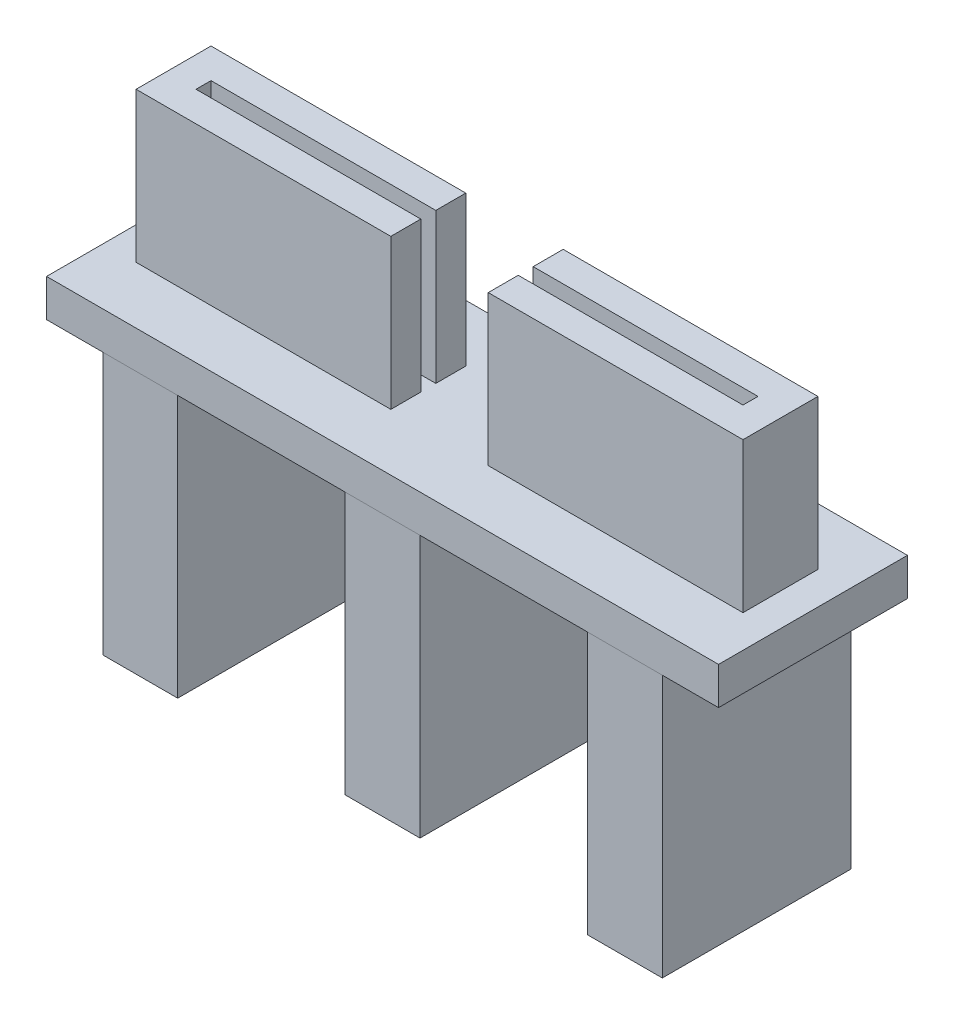
ISO-10303-21;
HEADER;
FILE_DESCRIPTION(('STEP AP214'),'2;1');
FILE_NAME('part.step','',(''),(''),'','','');
FILE_SCHEMA(('AUTOMOTIVE_DESIGN { 1 0 10303 214 1 1 1 1 }'));
ENDSEC;
DATA;
#1=APPLICATION_CONTEXT('core data for automotive mechanical design processes');
#2=APPLICATION_PROTOCOL_DEFINITION('international standard','automotive_design',2000,#1);
#3=PRODUCT_CONTEXT('',#1,'mechanical');
#4=PRODUCT('Part','Part','',(#3));
#5=PRODUCT_RELATED_PRODUCT_CATEGORY('part','',(#4));
#6=PRODUCT_DEFINITION_FORMATION('','',#4);
#7=PRODUCT_DEFINITION_CONTEXT('part definition',#1,'design');
#8=PRODUCT_DEFINITION('design','',#6,#7);
#9=PRODUCT_DEFINITION_SHAPE('','',#8);
#10=(LENGTH_UNIT() NAMED_UNIT(*) SI_UNIT(.MILLI.,.METRE.));
#11=(NAMED_UNIT(*) PLANE_ANGLE_UNIT() SI_UNIT($,.RADIAN.));
#12=(NAMED_UNIT(*) SI_UNIT($,.STERADIAN.) SOLID_ANGLE_UNIT());
#13=UNCERTAINTY_MEASURE_WITH_UNIT(LENGTH_MEASURE(1.E-05),#10,'distance_accuracy_value','');
#14=(GEOMETRIC_REPRESENTATION_CONTEXT(3) GLOBAL_UNCERTAINTY_ASSIGNED_CONTEXT((#13)) GLOBAL_UNIT_ASSIGNED_CONTEXT((#10,
#11,#12)) REPRESENTATION_CONTEXT('',''));
#15=CARTESIAN_POINT('',(0.,0.,0.));
#16=DIRECTION('',(0.,0.,1.));
#17=DIRECTION('',(1.,0.,0.));
#18=AXIS2_PLACEMENT_3D('',#15,#16,#17);
#19=CARTESIAN_POINT('',(0.,35.,0.));
#20=DIRECTION('',(0.,-1.,0.));
#21=DIRECTION('',(0.,0.,-1.));
#22=AXIS2_PLACEMENT_3D('',#19,#20,#21);
#23=PLANE('',#22);
#24=DIRECTION('',(-1.,0.,0.));
#25=VECTOR('',#24,1.);
#26=CARTESIAN_POINT('',(0.,35.,12.6054154397863));
#27=LINE('',#26,#25);
#28=CARTESIAN_POINT('',(5.00000000000002,35.,12.6054154397863));
#29=VERTEX_POINT('',#28);
#30=CARTESIAN_POINT('',(-4.99999999999998,35.,12.6054154397863));
#31=VERTEX_POINT('',#30);
#32=EDGE_CURVE('E131',#29,#31,#27,.T.);
#33=ORIENTED_EDGE('',*,*,#32,.F.);
#34=DIRECTION('',(0.,0.,1.));
#35=VECTOR('',#34,1.);
#36=CARTESIAN_POINT('',(5.00000000000002,35.,0.));
#37=LINE('',#36,#35);
#38=CARTESIAN_POINT('',(5.00000000000003,35.,-12.6054154397863));
#39=VERTEX_POINT('',#38);
#40=EDGE_CURVE('E126',#39,#29,#37,.T.);
#41=ORIENTED_EDGE('',*,*,#40,.F.);
#42=DIRECTION('',(1.,0.,0.));
#43=VECTOR('',#42,1.);
#44=CARTESIAN_POINT('',(0.,35.,-12.6054154397863));
#45=LINE('',#44,#43);
#46=CARTESIAN_POINT('',(-4.99999999999997,35.,-12.6054154397863));
#47=VERTEX_POINT('',#46);
#48=EDGE_CURVE('E121',#47,#39,#45,.T.);
#49=ORIENTED_EDGE('',*,*,#48,.F.);
#50=DIRECTION('',(0.,0.,-1.));
#51=VECTOR('',#50,1.);
#52=CARTESIAN_POINT('',(-4.99999999999998,35.,0.));
#53=LINE('',#52,#51);
#54=EDGE_CURVE('E120',#31,#47,#53,.T.);
#55=ORIENTED_EDGE('',*,*,#54,.F.);
#56=EDGE_LOOP('',(#33,#41,#49,#55));
#57=FACE_BOUND('',#56,.T.);
#58=ADVANCED_FACE('F69',(#57),#23,.F.);
#59=CARTESIAN_POINT('',(-4.99999999999998,40.002,0.));
#60=DIRECTION('',(1.,0.,0.));
#61=DIRECTION('',(0.,0.,-1.));
#62=AXIS2_PLACEMENT_3D('',#59,#60,#61);
#63=PLANE('',#62);
#64=DIRECTION('',(0.,-1.,0.));
#65=VECTOR('',#64,1.);
#66=CARTESIAN_POINT('',(-4.99999999999998,40.002,12.6054154397863));
#67=LINE('',#66,#65);
#68=CARTESIAN_POINT('',(-4.99999999999998,0.,12.6054154397863));
#69=VERTEX_POINT('',#68);
#70=EDGE_CURVE('E84',#31,#69,#67,.T.);
#71=ORIENTED_EDGE('',*,*,#70,.F.);
#72=ORIENTED_EDGE('',*,*,#54,.T.);
#73=DIRECTION('',(0.,1.,0.));
#74=VECTOR('',#73,1.);
#75=CARTESIAN_POINT('',(-4.99999999999997,40.002,-12.6054154397863));
#76=LINE('',#75,#74);
#77=CARTESIAN_POINT('',(-4.99999999999998,0.,-12.6054154397863));
#78=VERTEX_POINT('',#77);
#79=EDGE_CURVE('E108',#78,#47,#76,.T.);
#80=ORIENTED_EDGE('',*,*,#79,.F.);
#81=DIRECTION('',(0.,0.,1.));
#82=VECTOR('',#81,1.);
#83=CARTESIAN_POINT('',(-4.99999999999998,0.,0.));
#84=LINE('',#83,#82);
#85=EDGE_CURVE('E118',#78,#69,#84,.T.);
#86=ORIENTED_EDGE('',*,*,#85,.T.);
#87=EDGE_LOOP('',(#71,#72,#80,#86));
#88=FACE_BOUND('',#87,.T.);
#89=ADVANCED_FACE('F71',(#88),#63,.F.);
#90=CARTESIAN_POINT('',(5.00000000000002,40.002,0.));
#91=DIRECTION('',(-1.,0.,0.));
#92=DIRECTION('',(0.,0.,1.));
#93=AXIS2_PLACEMENT_3D('',#90,#91,#92);
#94=PLANE('',#93);
#95=DIRECTION('',(0.,1.,0.));
#96=VECTOR('',#95,1.);
#97=CARTESIAN_POINT('',(5.00000000000002,40.002,12.6054154397863));
#98=LINE('',#97,#96);
#99=CARTESIAN_POINT('',(5.00000000000002,0.,12.6054154397863));
#100=VERTEX_POINT('',#99);
#101=EDGE_CURVE('E134',#100,#29,#98,.T.);
#102=ORIENTED_EDGE('',*,*,#101,.F.);
#103=DIRECTION('',(0.,0.,-1.));
#104=VECTOR('',#103,1.);
#105=CARTESIAN_POINT('',(5.00000000000002,0.,0.));
#106=LINE('',#105,#104);
#107=CARTESIAN_POINT('',(5.00000000000003,0.,-12.6054154397863));
#108=VERTEX_POINT('',#107);
#109=EDGE_CURVE('E114',#100,#108,#106,.T.);
#110=ORIENTED_EDGE('',*,*,#109,.T.);
#111=DIRECTION('',(0.,-1.,0.));
#112=VECTOR('',#111,1.);
#113=CARTESIAN_POINT('',(5.00000000000003,40.002,-12.6054154397863));
#114=LINE('',#113,#112);
#115=EDGE_CURVE('E91',#39,#108,#114,.T.);
#116=ORIENTED_EDGE('',*,*,#115,.F.);
#117=ORIENTED_EDGE('',*,*,#40,.T.);
#118=EDGE_LOOP('',(#102,#110,#116,#117));
#119=FACE_BOUND('',#118,.T.);
#120=ADVANCED_FACE('F141',(#119),#94,.F.);
#121=CARTESIAN_POINT('',(0.,0.,0.));
#122=DIRECTION('',(0.,-1.,0.));
#123=DIRECTION('',(0.,0.,-1.));
#124=AXIS2_PLACEMENT_3D('',#121,#122,#123);
#125=PLANE('',#124);
#126=ORIENTED_EDGE('',*,*,#109,.F.);
#127=DIRECTION('',(-1.,0.,0.));
#128=VECTOR('',#127,1.);
#129=CARTESIAN_POINT('',(0.,0.,12.6054154397863));
#130=LINE('',#129,#128);
#131=EDGE_CURVE('E14',#100,#69,#130,.T.);
#132=ORIENTED_EDGE('',*,*,#131,.T.);
#133=ORIENTED_EDGE('',*,*,#85,.F.);
#134=DIRECTION('',(1.,0.,0.));
#135=VECTOR('',#134,1.);
#136=CARTESIAN_POINT('',(0.,0.,-12.6054154397863));
#137=LINE('',#136,#135);
#138=EDGE_CURVE('E77',#78,#108,#137,.T.);
#139=ORIENTED_EDGE('',*,*,#138,.T.);
#140=EDGE_LOOP('',(#126,#132,#133,#139));
#141=FACE_BOUND('',#140,.T.);
#142=ADVANCED_FACE('F123',(#141),#125,.T.);
#143=CARTESIAN_POINT('',(-44.8422155808786,-30.,-12.6054154397863));
#144=DIRECTION('',(0.,0.,-1.));
#145=DIRECTION('',(-1.,0.,0.));
#146=AXIS2_PLACEMENT_3D('',#143,#144,#145);
#147=PLANE('',#146);
#148=ORIENTED_EDGE('',*,*,#48,.T.);
#149=ORIENTED_EDGE('',*,*,#115,.T.);
#150=ORIENTED_EDGE('',*,*,#138,.F.);
#151=ORIENTED_EDGE('',*,*,#79,.T.);
#152=EDGE_LOOP('',(#148,#149,#150,#151));
#153=FACE_BOUND('',#152,.T.);
#154=ADVANCED_FACE('F107',(#153),#147,.T.);
#155=CARTESIAN_POINT('',(-44.8422155808786,-30.,12.6054154397863));
#156=DIRECTION('',(0.,0.,1.));
#157=DIRECTION('',(1.,0.,0.));
#158=AXIS2_PLACEMENT_3D('',#155,#156,#157);
#159=PLANE('',#158);
#160=ORIENTED_EDGE('',*,*,#32,.T.);
#161=ORIENTED_EDGE('',*,*,#70,.T.);
#162=ORIENTED_EDGE('',*,*,#131,.F.);
#163=ORIENTED_EDGE('',*,*,#101,.T.);
#164=EDGE_LOOP('',(#160,#161,#162,#163));
#165=FACE_BOUND('',#164,.T.);
#166=ADVANCED_FACE('F143',(#165),#159,.T.);
#167=CLOSED_SHELL('',(#58,#89,#120,#142,#154,#166));
#168=MANIFOLD_SOLID_BREP('B2',#167);
#169=CARTESIAN_POINT('',(0.,35.,0.));
#170=DIRECTION('',(0.,-1.,0.));
#171=DIRECTION('',(0.,0.,-1.));
#172=AXIS2_PLACEMENT_3D('',#169,#170,#171);
#173=PLANE('',#172);
#174=DIRECTION('',(-1.,0.,0.));
#175=VECTOR('',#174,1.);
#176=CARTESIAN_POINT('',(0.,35.,12.6054154397863));
#177=LINE('',#176,#175);
#178=CARTESIAN_POINT('',(37.3395555688102,35.,12.6054154397863));
#179=VERTEX_POINT('',#178);
#180=CARTESIAN_POINT('',(27.3395555688102,35.,12.6054154397863));
#181=VERTEX_POINT('',#180);
#182=EDGE_CURVE('E264',#179,#181,#177,.T.);
#183=ORIENTED_EDGE('',*,*,#182,.F.);
#184=DIRECTION('',(0.,0.,1.));
#185=VECTOR('',#184,1.);
#186=CARTESIAN_POINT('',(37.3395555688102,35.,0.));
#187=LINE('',#186,#185);
#188=CARTESIAN_POINT('',(37.3395555688102,35.,-12.6054154397863));
#189=VERTEX_POINT('',#188);
#190=EDGE_CURVE('E259',#189,#179,#187,.T.);
#191=ORIENTED_EDGE('',*,*,#190,.F.);
#192=DIRECTION('',(1.,0.,0.));
#193=VECTOR('',#192,1.);
#194=CARTESIAN_POINT('',(0.,35.,-12.6054154397863));
#195=LINE('',#194,#193);
#196=CARTESIAN_POINT('',(27.3395555688102,35.,-12.6054154397863));
#197=VERTEX_POINT('',#196);
#198=EDGE_CURVE('E254',#197,#189,#195,.T.);
#199=ORIENTED_EDGE('',*,*,#198,.F.);
#200=DIRECTION('',(0.,0.,-1.));
#201=VECTOR('',#200,1.);
#202=CARTESIAN_POINT('',(27.3395555688102,35.,0.));
#203=LINE('',#202,#201);
#204=EDGE_CURVE('E253',#181,#197,#203,.T.);
#205=ORIENTED_EDGE('',*,*,#204,.F.);
#206=EDGE_LOOP('',(#183,#191,#199,#205));
#207=FACE_BOUND('',#206,.T.);
#208=ADVANCED_FACE('F202',(#207),#173,.F.);
#209=CARTESIAN_POINT('',(27.3395555688102,40.002,0.));
#210=DIRECTION('',(1.,0.,0.));
#211=DIRECTION('',(0.,0.,-1.));
#212=AXIS2_PLACEMENT_3D('',#209,#210,#211);
#213=PLANE('',#212);
#214=DIRECTION('',(0.,-1.,0.));
#215=VECTOR('',#214,1.);
#216=CARTESIAN_POINT('',(27.3395555688102,40.002,12.6054154397863));
#217=LINE('',#216,#215);
#218=CARTESIAN_POINT('',(27.3395555688102,0.,12.6054154397863));
#219=VERTEX_POINT('',#218);
#220=EDGE_CURVE('E217',#181,#219,#217,.T.);
#221=ORIENTED_EDGE('',*,*,#220,.F.);
#222=ORIENTED_EDGE('',*,*,#204,.T.);
#223=DIRECTION('',(0.,1.,0.));
#224=VECTOR('',#223,1.);
#225=CARTESIAN_POINT('',(27.3395555688102,40.002,-12.6054154397863));
#226=LINE('',#225,#224);
#227=CARTESIAN_POINT('',(27.3395555688102,0.,-12.6054154397863));
#228=VERTEX_POINT('',#227);
#229=EDGE_CURVE('E241',#228,#197,#226,.T.);
#230=ORIENTED_EDGE('',*,*,#229,.F.);
#231=DIRECTION('',(0.,0.,1.));
#232=VECTOR('',#231,1.);
#233=CARTESIAN_POINT('',(27.3395555688102,0.,0.));
#234=LINE('',#233,#232);
#235=EDGE_CURVE('E251',#228,#219,#234,.T.);
#236=ORIENTED_EDGE('',*,*,#235,.T.);
#237=EDGE_LOOP('',(#221,#222,#230,#236));
#238=FACE_BOUND('',#237,.T.);
#239=ADVANCED_FACE('F204',(#238),#213,.F.);
#240=CARTESIAN_POINT('',(37.3395555688102,40.002,0.));
#241=DIRECTION('',(-1.,0.,0.));
#242=DIRECTION('',(0.,0.,1.));
#243=AXIS2_PLACEMENT_3D('',#240,#241,#242);
#244=PLANE('',#243);
#245=DIRECTION('',(0.,1.,0.));
#246=VECTOR('',#245,1.);
#247=CARTESIAN_POINT('',(37.3395555688102,40.002,12.6054154397863));
#248=LINE('',#247,#246);
#249=CARTESIAN_POINT('',(37.3395555688102,0.,12.6054154397863));
#250=VERTEX_POINT('',#249);
#251=EDGE_CURVE('E267',#250,#179,#248,.T.);
#252=ORIENTED_EDGE('',*,*,#251,.F.);
#253=DIRECTION('',(0.,0.,-1.));
#254=VECTOR('',#253,1.);
#255=CARTESIAN_POINT('',(37.3395555688102,0.,0.));
#256=LINE('',#255,#254);
#257=CARTESIAN_POINT('',(37.3395555688102,0.,-12.6054154397863));
#258=VERTEX_POINT('',#257);
#259=EDGE_CURVE('E247',#250,#258,#256,.T.);
#260=ORIENTED_EDGE('',*,*,#259,.T.);
#261=DIRECTION('',(0.,-1.,0.));
#262=VECTOR('',#261,1.);
#263=CARTESIAN_POINT('',(37.3395555688102,40.002,-12.6054154397863));
#264=LINE('',#263,#262);
#265=EDGE_CURVE('E224',#189,#258,#264,.T.);
#266=ORIENTED_EDGE('',*,*,#265,.F.);
#267=ORIENTED_EDGE('',*,*,#190,.T.);
#268=EDGE_LOOP('',(#252,#260,#266,#267));
#269=FACE_BOUND('',#268,.T.);
#270=ADVANCED_FACE('F274',(#269),#244,.F.);
#271=CARTESIAN_POINT('',(0.,0.,0.));
#272=DIRECTION('',(0.,-1.,0.));
#273=DIRECTION('',(0.,0.,-1.));
#274=AXIS2_PLACEMENT_3D('',#271,#272,#273);
#275=PLANE('',#274);
#276=ORIENTED_EDGE('',*,*,#259,.F.);
#277=DIRECTION('',(-1.,0.,0.));
#278=VECTOR('',#277,1.);
#279=CARTESIAN_POINT('',(0.,0.,12.6054154397863));
#280=LINE('',#279,#278);
#281=EDGE_CURVE('E67',#250,#219,#280,.T.);
#282=ORIENTED_EDGE('',*,*,#281,.T.);
#283=ORIENTED_EDGE('',*,*,#235,.F.);
#284=DIRECTION('',(1.,0.,0.));
#285=VECTOR('',#284,1.);
#286=CARTESIAN_POINT('',(0.,0.,-12.6054154397863));
#287=LINE('',#286,#285);
#288=EDGE_CURVE('E210',#228,#258,#287,.T.);
#289=ORIENTED_EDGE('',*,*,#288,.T.);
#290=EDGE_LOOP('',(#276,#282,#283,#289));
#291=FACE_BOUND('',#290,.T.);
#292=ADVANCED_FACE('F256',(#291),#275,.T.);
#293=CARTESIAN_POINT('',(-44.8422155808786,-30.,-12.6054154397863));
#294=DIRECTION('',(0.,0.,-1.));
#295=DIRECTION('',(-1.,0.,0.));
#296=AXIS2_PLACEMENT_3D('',#293,#294,#295);
#297=PLANE('',#296);
#298=ORIENTED_EDGE('',*,*,#198,.T.);
#299=ORIENTED_EDGE('',*,*,#265,.T.);
#300=ORIENTED_EDGE('',*,*,#288,.F.);
#301=ORIENTED_EDGE('',*,*,#229,.T.);
#302=EDGE_LOOP('',(#298,#299,#300,#301));
#303=FACE_BOUND('',#302,.T.);
#304=ADVANCED_FACE('F240',(#303),#297,.T.);
#305=CARTESIAN_POINT('',(-44.8422155808786,-30.,12.6054154397863));
#306=DIRECTION('',(0.,0.,1.));
#307=DIRECTION('',(1.,0.,0.));
#308=AXIS2_PLACEMENT_3D('',#305,#306,#307);
#309=PLANE('',#308);
#310=ORIENTED_EDGE('',*,*,#182,.T.);
#311=ORIENTED_EDGE('',*,*,#220,.T.);
#312=ORIENTED_EDGE('',*,*,#281,.F.);
#313=ORIENTED_EDGE('',*,*,#251,.T.);
#314=EDGE_LOOP('',(#310,#311,#312,#313));
#315=FACE_BOUND('',#314,.T.);
#316=ADVANCED_FACE('F276',(#315),#309,.T.);
#317=CLOSED_SHELL('',(#208,#239,#270,#292,#304,#316));
#318=MANIFOLD_SOLID_BREP('B8',#317);
#319=CARTESIAN_POINT('',(0.,35.,0.));
#320=DIRECTION('',(0.,-1.,0.));
#321=DIRECTION('',(0.,0.,-1.));
#322=AXIS2_PLACEMENT_3D('',#319,#320,#321);
#323=PLANE('',#322);
#324=DIRECTION('',(-1.,0.,0.));
#325=VECTOR('',#324,1.);
#326=CARTESIAN_POINT('',(0.,35.,12.6054154397863));
#327=LINE('',#326,#325);
#328=CARTESIAN_POINT('',(-27.3395555688102,35.,12.6054154397863));
#329=VERTEX_POINT('',#328);
#330=CARTESIAN_POINT('',(-37.3395555688102,35.,12.6054154397863));
#331=VERTEX_POINT('',#330);
#332=EDGE_CURVE('E393',#329,#331,#327,.T.);
#333=ORIENTED_EDGE('',*,*,#332,.F.);
#334=DIRECTION('',(0.,0.,-1.));
#335=VECTOR('',#334,1.);
#336=CARTESIAN_POINT('',(-27.3395555688102,35.,0.));
#337=LINE('',#336,#335);
#338=CARTESIAN_POINT('',(-27.3395555688102,35.,-12.6054154397863));
#339=VERTEX_POINT('',#338);
#340=EDGE_CURVE('E388',#329,#339,#337,.T.);
#341=ORIENTED_EDGE('',*,*,#340,.T.);
#342=DIRECTION('',(1.,0.,0.));
#343=VECTOR('',#342,1.);
#344=CARTESIAN_POINT('',(0.,35.,-12.6054154397863));
#345=LINE('',#344,#343);
#346=CARTESIAN_POINT('',(-37.3395555688102,35.,-12.6054154397863));
#347=VERTEX_POINT('',#346);
#348=EDGE_CURVE('E385',#347,#339,#345,.T.);
#349=ORIENTED_EDGE('',*,*,#348,.F.);
#350=DIRECTION('',(0.,0.,1.));
#351=VECTOR('',#350,1.);
#352=CARTESIAN_POINT('',(-37.3395555688102,35.,0.));
#353=LINE('',#352,#351);
#354=EDGE_CURVE('E378',#347,#331,#353,.T.);
#355=ORIENTED_EDGE('',*,*,#354,.T.);
#356=EDGE_LOOP('',(#333,#341,#349,#355));
#357=FACE_BOUND('',#356,.T.);
#358=ADVANCED_FACE('F334',(#357),#323,.F.);
#359=CARTESIAN_POINT('',(-37.3395555688102,40.002,0.));
#360=DIRECTION('',(-1.,0.,0.));
#361=DIRECTION('',(0.,0.,1.));
#362=AXIS2_PLACEMENT_3D('',#359,#360,#361);
#363=PLANE('',#362);
#364=DIRECTION('',(0.,0.,-1.));
#365=VECTOR('',#364,1.);
#366=CARTESIAN_POINT('',(-37.3395555688102,0.,0.));
#367=LINE('',#366,#365);
#368=CARTESIAN_POINT('',(-37.3395555688102,0.,12.6054154397863));
#369=VERTEX_POINT('',#368);
#370=CARTESIAN_POINT('',(-37.3395555688102,0.,-12.6054154397863));
#371=VERTEX_POINT('',#370);
#372=EDGE_CURVE('E383',#369,#371,#367,.T.);
#373=ORIENTED_EDGE('',*,*,#372,.F.);
#374=DIRECTION('',(0.,1.,0.));
#375=VECTOR('',#374,1.);
#376=CARTESIAN_POINT('',(-37.3395555688102,40.002,12.6054154397863));
#377=LINE('',#376,#375);
#378=EDGE_CURVE('E348',#369,#331,#377,.T.);
#379=ORIENTED_EDGE('',*,*,#378,.T.);
#380=ORIENTED_EDGE('',*,*,#354,.F.);
#381=DIRECTION('',(0.,-1.,0.));
#382=VECTOR('',#381,1.);
#383=CARTESIAN_POINT('',(-37.3395555688102,40.002,-12.6054154397863));
#384=LINE('',#383,#382);
#385=EDGE_CURVE('E372',#347,#371,#384,.T.);
#386=ORIENTED_EDGE('',*,*,#385,.T.);
#387=EDGE_LOOP('',(#373,#379,#380,#386));
#388=FACE_BOUND('',#387,.T.);
#389=ADVANCED_FACE('F382',(#388),#363,.T.);
#390=CARTESIAN_POINT('',(-27.3395555688102,40.002,0.));
#391=DIRECTION('',(1.,0.,0.));
#392=DIRECTION('',(0.,0.,-1.));
#393=AXIS2_PLACEMENT_3D('',#390,#391,#392);
#394=PLANE('',#393);
#395=ORIENTED_EDGE('',*,*,#340,.F.);
#396=DIRECTION('',(0.,-1.,0.));
#397=VECTOR('',#396,1.);
#398=CARTESIAN_POINT('',(-27.3395555688102,40.002,12.6054154397863));
#399=LINE('',#398,#397);
#400=CARTESIAN_POINT('',(-27.3395555688102,0.,12.6054154397863));
#401=VERTEX_POINT('',#400);
#402=EDGE_CURVE('E400',#329,#401,#399,.T.);
#403=ORIENTED_EDGE('',*,*,#402,.T.);
#404=DIRECTION('',(0.,0.,1.));
#405=VECTOR('',#404,1.);
#406=CARTESIAN_POINT('',(-27.3395555688102,0.,0.));
#407=LINE('',#406,#405);
#408=CARTESIAN_POINT('',(-27.3395555688102,0.,-12.6054154397863));
#409=VERTEX_POINT('',#408);
#410=EDGE_CURVE('E389',#409,#401,#407,.T.);
#411=ORIENTED_EDGE('',*,*,#410,.F.);
#412=DIRECTION('',(0.,1.,0.));
#413=VECTOR('',#412,1.);
#414=CARTESIAN_POINT('',(-27.3395555688102,40.002,-12.6054154397863));
#415=LINE('',#414,#413);
#416=EDGE_CURVE('E355',#409,#339,#415,.T.);
#417=ORIENTED_EDGE('',*,*,#416,.T.);
#418=EDGE_LOOP('',(#395,#403,#411,#417));
#419=FACE_BOUND('',#418,.T.);
#420=ADVANCED_FACE('F408',(#419),#394,.T.);
#421=CARTESIAN_POINT('',(0.,0.,0.));
#422=DIRECTION('',(0.,-1.,0.));
#423=DIRECTION('',(0.,0.,-1.));
#424=AXIS2_PLACEMENT_3D('',#421,#422,#423);
#425=PLANE('',#424);
#426=ORIENTED_EDGE('',*,*,#410,.T.);
#427=DIRECTION('',(-1.,0.,0.));
#428=VECTOR('',#427,1.);
#429=CARTESIAN_POINT('',(0.,0.,12.6054154397863));
#430=LINE('',#429,#428);
#431=EDGE_CURVE('E200',#401,#369,#430,.T.);
#432=ORIENTED_EDGE('',*,*,#431,.T.);
#433=ORIENTED_EDGE('',*,*,#372,.T.);
#434=DIRECTION('',(1.,0.,0.));
#435=VECTOR('',#434,1.);
#436=CARTESIAN_POINT('',(0.,0.,-12.6054154397863));
#437=LINE('',#436,#435);
#438=EDGE_CURVE('E341',#371,#409,#437,.T.);
#439=ORIENTED_EDGE('',*,*,#438,.T.);
#440=EDGE_LOOP('',(#426,#432,#433,#439));
#441=FACE_BOUND('',#440,.T.);
#442=ADVANCED_FACE('F387',(#441),#425,.T.);
#443=CARTESIAN_POINT('',(-44.8422155808786,-30.,-12.6054154397863));
#444=DIRECTION('',(0.,0.,-1.));
#445=DIRECTION('',(-1.,0.,0.));
#446=AXIS2_PLACEMENT_3D('',#443,#444,#445);
#447=PLANE('',#446);
#448=ORIENTED_EDGE('',*,*,#348,.T.);
#449=ORIENTED_EDGE('',*,*,#416,.F.);
#450=ORIENTED_EDGE('',*,*,#438,.F.);
#451=ORIENTED_EDGE('',*,*,#385,.F.);
#452=EDGE_LOOP('',(#448,#449,#450,#451));
#453=FACE_BOUND('',#452,.T.);
#454=ADVANCED_FACE('F371',(#453),#447,.T.);
#455=CARTESIAN_POINT('',(-44.8422155808786,-30.,12.6054154397863));
#456=DIRECTION('',(0.,0.,1.));
#457=DIRECTION('',(1.,0.,0.));
#458=AXIS2_PLACEMENT_3D('',#455,#456,#457);
#459=PLANE('',#458);
#460=ORIENTED_EDGE('',*,*,#332,.T.);
#461=ORIENTED_EDGE('',*,*,#378,.F.);
#462=ORIENTED_EDGE('',*,*,#431,.F.);
#463=ORIENTED_EDGE('',*,*,#402,.F.);
#464=EDGE_LOOP('',(#460,#461,#462,#463));
#465=FACE_BOUND('',#464,.T.);
#466=ADVANCED_FACE('F406',(#465),#459,.T.);
#467=CLOSED_SHELL('',(#358,#389,#420,#442,#454,#466));
#468=MANIFOLD_SOLID_BREP('B61',#467);
#469=CARTESIAN_POINT('',(0.,35.,0.));
#470=DIRECTION('',(0.,-1.,0.));
#471=DIRECTION('',(0.,0.,-1.));
#472=AXIS2_PLACEMENT_3D('',#469,#470,#471);
#473=PLANE('',#472);
#474=DIRECTION('',(1.,0.,0.));
#475=VECTOR('',#474,1.);
#476=CARTESIAN_POINT('',(0.,35.,-12.6054154397863));
#477=LINE('',#476,#475);
#478=CARTESIAN_POINT('',(-44.8422155808786,35.,-12.6054154397863));
#479=VERTEX_POINT('',#478);
#480=CARTESIAN_POINT('',(44.8422155808786,35.,-12.6054154397863));
#481=VERTEX_POINT('',#480);
#482=EDGE_CURVE('E750',#479,#481,#477,.T.);
#483=ORIENTED_EDGE('',*,*,#482,.T.);
#484=DIRECTION('',(0.,0.,1.));
#485=VECTOR('',#484,1.);
#486=CARTESIAN_POINT('',(44.8422155808786,35.,0.));
#487=LINE('',#486,#485);
#488=CARTESIAN_POINT('',(44.8422155808786,35.,12.6054154397863));
#489=VERTEX_POINT('',#488);
#490=EDGE_CURVE('E332',#481,#489,#487,.T.);
#491=ORIENTED_EDGE('',*,*,#490,.T.);
#492=DIRECTION('',(-1.,0.,0.));
#493=VECTOR('',#492,1.);
#494=CARTESIAN_POINT('',(0.,35.,12.6054154397863));
#495=LINE('',#494,#493);
#496=CARTESIAN_POINT('',(-44.8422155808786,35.,12.6054154397863));
#497=VERTEX_POINT('',#496);
#498=EDGE_CURVE('E465',#489,#497,#495,.T.);
#499=ORIENTED_EDGE('',*,*,#498,.T.);
#500=DIRECTION('',(0.,0.,-1.));
#501=VECTOR('',#500,1.);
#502=CARTESIAN_POINT('',(-44.8422155808786,35.,0.));
#503=LINE('',#502,#501);
#504=EDGE_CURVE('E597',#497,#479,#503,.T.);
#505=ORIENTED_EDGE('',*,*,#504,.T.);
#506=EDGE_LOOP('',(#483,#491,#499,#505));
#507=FACE_BOUND('',#506,.T.);
#508=ADVANCED_FACE('F457',(#507),#473,.T.);
#509=CARTESIAN_POINT('',(44.8422155808786,-30.,12.6054154397863));
#510=DIRECTION('',(1.,0.,0.));
#511=DIRECTION('',(0.,0.,-1.));
#512=AXIS2_PLACEMENT_3D('',#509,#510,#511);
#513=PLANE('',#512);
#514=DIRECTION('',(0.,1.,0.));
#515=VECTOR('',#514,1.);
#516=CARTESIAN_POINT('',(44.8422155808786,-30.,-12.6054154397863));
#517=LINE('',#516,#515);
#518=CARTESIAN_POINT('',(44.8422155808786,40.,-12.6054154397863));
#519=VERTEX_POINT('',#518);
#520=EDGE_CURVE('E480',#481,#519,#517,.T.);
#521=ORIENTED_EDGE('',*,*,#520,.T.);
#522=DIRECTION('',(0.,0.,-1.));
#523=VECTOR('',#522,1.);
#524=CARTESIAN_POINT('',(44.8422155808786,40.,12.6054154397863));
#525=LINE('',#524,#523);
#526=CARTESIAN_POINT('',(44.8422155808786,40.,12.6054154397863));
#527=VERTEX_POINT('',#526);
#528=EDGE_CURVE('E614',#527,#519,#525,.T.);
#529=ORIENTED_EDGE('',*,*,#528,.F.);
#530=DIRECTION('',(0.,1.,0.));
#531=VECTOR('',#530,1.);
#532=CARTESIAN_POINT('',(44.8422155808786,-30.,12.6054154397863));
#533=LINE('',#532,#531);
#534=EDGE_CURVE('E600',#489,#527,#533,.T.);
#535=ORIENTED_EDGE('',*,*,#534,.F.);
#536=ORIENTED_EDGE('',*,*,#490,.F.);
#537=EDGE_LOOP('',(#521,#529,#535,#536));
#538=FACE_BOUND('',#537,.T.);
#539=ADVANCED_FACE('F755',(#538),#513,.T.);
#540=CARTESIAN_POINT('',(-44.8422155808786,-30.,12.6054154397863));
#541=DIRECTION('',(0.,0.,1.));
#542=DIRECTION('',(1.,0.,0.));
#543=AXIS2_PLACEMENT_3D('',#540,#541,#542);
#544=PLANE('',#543);
#545=ORIENTED_EDGE('',*,*,#534,.T.);
#546=DIRECTION('',(1.,0.,0.));
#547=VECTOR('',#546,1.);
#548=CARTESIAN_POINT('',(-44.8422155808786,40.,12.6054154397863));
#549=LINE('',#548,#547);
#550=CARTESIAN_POINT('',(-44.8422155808786,40.,12.6054154397863));
#551=VERTEX_POINT('',#550);
#552=EDGE_CURVE('E604',#551,#527,#549,.T.);
#553=ORIENTED_EDGE('',*,*,#552,.F.);
#554=DIRECTION('',(0.,1.,0.));
#555=VECTOR('',#554,1.);
#556=CARTESIAN_POINT('',(-44.8422155808786,-30.,12.6054154397863));
#557=LINE('',#556,#555);
#558=EDGE_CURVE('E593',#497,#551,#557,.T.);
#559=ORIENTED_EDGE('',*,*,#558,.F.);
#560=ORIENTED_EDGE('',*,*,#498,.F.);
#561=EDGE_LOOP('',(#545,#553,#559,#560));
#562=FACE_BOUND('',#561,.T.);
#563=ADVANCED_FACE('F605',(#562),#544,.T.);
#564=CARTESIAN_POINT('',(-44.8422155808786,-30.,12.6054154397863));
#565=DIRECTION('',(-1.,0.,0.));
#566=DIRECTION('',(0.,0.,1.));
#567=AXIS2_PLACEMENT_3D('',#564,#565,#566);
#568=PLANE('',#567);
#569=ORIENTED_EDGE('',*,*,#558,.T.);
#570=DIRECTION('',(0.,0.,1.));
#571=VECTOR('',#570,1.);
#572=CARTESIAN_POINT('',(-44.8422155808786,40.,12.6054154397863));
#573=LINE('',#572,#571);
#574=CARTESIAN_POINT('',(-44.8422155808786,40.,-12.6054154397863));
#575=VERTEX_POINT('',#574);
#576=EDGE_CURVE('E472',#575,#551,#573,.T.);
#577=ORIENTED_EDGE('',*,*,#576,.F.);
#578=DIRECTION('',(0.,1.,0.));
#579=VECTOR('',#578,1.);
#580=CARTESIAN_POINT('',(-44.8422155808786,-30.,-12.6054154397863));
#581=LINE('',#580,#579);
#582=EDGE_CURVE('E601',#479,#575,#581,.T.);
#583=ORIENTED_EDGE('',*,*,#582,.F.);
#584=ORIENTED_EDGE('',*,*,#504,.F.);
#585=EDGE_LOOP('',(#569,#577,#583,#584));
#586=FACE_BOUND('',#585,.T.);
#587=ADVANCED_FACE('F595',(#586),#568,.T.);
#588=CARTESIAN_POINT('',(-44.8422155808786,-30.,-12.6054154397863));
#589=DIRECTION('',(0.,0.,-1.));
#590=DIRECTION('',(-1.,0.,0.));
#591=AXIS2_PLACEMENT_3D('',#588,#589,#590);
#592=PLANE('',#591);
#593=ORIENTED_EDGE('',*,*,#582,.T.);
#594=DIRECTION('',(-1.,0.,0.));
#595=VECTOR('',#594,1.);
#596=CARTESIAN_POINT('',(-44.8422155808786,40.,-12.6054154397863));
#597=LINE('',#596,#595);
#598=EDGE_CURVE('E612',#519,#575,#597,.T.);
#599=ORIENTED_EDGE('',*,*,#598,.F.);
#600=ORIENTED_EDGE('',*,*,#520,.F.);
#601=ORIENTED_EDGE('',*,*,#482,.F.);
#602=EDGE_LOOP('',(#593,#599,#600,#601));
#603=FACE_BOUND('',#602,.T.);
#604=ADVANCED_FACE('F756',(#603),#592,.T.);
#605=CARTESIAN_POINT('',(0.,40.,0.));
#606=DIRECTION('',(0.,-1.,0.));
#607=DIRECTION('',(0.,0.,-1.));
#608=AXIS2_PLACEMENT_3D('',#605,#606,#607);
#609=PLANE('',#608);
#610=DIRECTION('',(-1.,0.,0.));
#611=VECTOR('',#610,1.);
#612=CARTESIAN_POINT('',(6.50000000000001,40.,-4.99999999999998));
#613=LINE('',#612,#611);
#614=CARTESIAN_POINT('',(40.5,40.,-4.99999999999992));
#615=VERTEX_POINT('',#614);
#616=CARTESIAN_POINT('',(6.50000000000001,40.,-4.99999999999998));
#617=VERTEX_POINT('',#616);
#618=EDGE_CURVE('E618',#615,#617,#613,.T.);
#619=ORIENTED_EDGE('',*,*,#618,.F.);
#620=DIRECTION('',(0.,0.,-1.));
#621=VECTOR('',#620,1.);
#622=CARTESIAN_POINT('',(40.5,40.,-4.99999999999992));
#623=LINE('',#622,#621);
#624=CARTESIAN_POINT('',(40.5,40.,5.00000000000008));
#625=VERTEX_POINT('',#624);
#626=EDGE_CURVE('E625',#625,#615,#623,.T.);
#627=ORIENTED_EDGE('',*,*,#626,.F.);
#628=DIRECTION('',(1.,0.,0.));
#629=VECTOR('',#628,1.);
#630=CARTESIAN_POINT('',(40.5,40.,5.00000000000008));
#631=LINE('',#630,#629);
#632=CARTESIAN_POINT('',(6.49999999999999,40.,5.00000000000001));
#633=VERTEX_POINT('',#632);
#634=EDGE_CURVE('E657',#633,#625,#631,.T.);
#635=ORIENTED_EDGE('',*,*,#634,.F.);
#636=DIRECTION('',(0.,0.,1.));
#637=VECTOR('',#636,1.);
#638=CARTESIAN_POINT('',(6.5,40.,1.00000000000002));
#639=LINE('',#638,#637);
#640=CARTESIAN_POINT('',(6.5,40.,1.00000000000002));
#641=VERTEX_POINT('',#640);
#642=EDGE_CURVE('E654',#641,#633,#639,.T.);
#643=ORIENTED_EDGE('',*,*,#642,.F.);
#644=DIRECTION('',(-1.,0.,0.));
#645=VECTOR('',#644,1.);
#646=CARTESIAN_POINT('',(36.5,40.,1.00000000000006));
#647=LINE('',#646,#645);
#648=CARTESIAN_POINT('',(36.5,40.,1.00000000000006));
#649=VERTEX_POINT('',#648);
#650=EDGE_CURVE('E651',#649,#641,#647,.T.);
#651=ORIENTED_EDGE('',*,*,#650,.F.);
#652=DIRECTION('',(0.,0.,1.));
#653=VECTOR('',#652,1.);
#654=CARTESIAN_POINT('',(36.5,40.,1.00000000000006));
#655=LINE('',#654,#653);
#656=CARTESIAN_POINT('',(36.5,40.,-0.999999999999935));
#657=VERTEX_POINT('',#656);
#658=EDGE_CURVE('E648',#657,#649,#655,.T.);
#659=ORIENTED_EDGE('',*,*,#658,.F.);
#660=DIRECTION('',(1.,0.,0.));
#661=VECTOR('',#660,1.);
#662=CARTESIAN_POINT('',(36.5,40.,-0.999999999999935));
#663=LINE('',#662,#661);
#664=CARTESIAN_POINT('',(6.5,40.,-0.999999999999977));
#665=VERTEX_POINT('',#664);
#666=EDGE_CURVE('E645',#665,#657,#663,.T.);
#667=ORIENTED_EDGE('',*,*,#666,.F.);
#668=DIRECTION('',(0.,0.,1.));
#669=VECTOR('',#668,1.);
#670=CARTESIAN_POINT('',(6.5,40.,-0.999999999999977));
#671=LINE('',#670,#669);
#672=EDGE_CURVE('E642',#617,#665,#671,.T.);
#673=ORIENTED_EDGE('',*,*,#672,.F.);
#674=EDGE_LOOP('',(#619,#627,#635,#643,#651,#659,#667,#673));
#675=FACE_BOUND('',#674,.T.);
#676=DIRECTION('',(0.,0.,-1.));
#677=VECTOR('',#676,1.);
#678=CARTESIAN_POINT('',(-6.5,40.,1.00000000000001));
#679=LINE('',#678,#677);
#680=CARTESIAN_POINT('',(-6.5,40.,5.00000000000001));
#681=VERTEX_POINT('',#680);
#682=CARTESIAN_POINT('',(-6.5,40.,1.00000000000001));
#683=VERTEX_POINT('',#682);
#684=EDGE_CURVE('E685',#681,#683,#679,.T.);
#685=ORIENTED_EDGE('',*,*,#684,.F.);
#686=DIRECTION('',(1.,0.,0.));
#687=VECTOR('',#686,1.);
#688=CARTESIAN_POINT('',(-6.5,40.,5.00000000000001));
#689=LINE('',#688,#687);
#690=CARTESIAN_POINT('',(-40.5,40.,5.00000000000001));
#691=VERTEX_POINT('',#690);
#692=EDGE_CURVE('E690',#691,#681,#689,.T.);
#693=ORIENTED_EDGE('',*,*,#692,.F.);
#694=DIRECTION('',(0.,0.,1.));
#695=VECTOR('',#694,1.);
#696=CARTESIAN_POINT('',(-40.5,40.,-4.99999999999999));
#697=LINE('',#696,#695);
#698=CARTESIAN_POINT('',(-40.5,40.,-4.99999999999999));
#699=VERTEX_POINT('',#698);
#700=EDGE_CURVE('E722',#699,#691,#697,.T.);
#701=ORIENTED_EDGE('',*,*,#700,.F.);
#702=DIRECTION('',(-1.,0.,0.));
#703=VECTOR('',#702,1.);
#704=CARTESIAN_POINT('',(-34.4332786519134,40.,-4.99999999999999));
#705=LINE('',#704,#703);
#706=CARTESIAN_POINT('',(-6.5,40.,-4.99999999999999));
#707=VERTEX_POINT('',#706);
#708=EDGE_CURVE('E719',#707,#699,#705,.T.);
#709=ORIENTED_EDGE('',*,*,#708,.F.);
#710=DIRECTION('',(0.,0.,-1.));
#711=VECTOR('',#710,1.);
#712=CARTESIAN_POINT('',(-6.5,40.,-0.999999999999991));
#713=LINE('',#712,#711);
#714=CARTESIAN_POINT('',(-6.5,40.,-0.999999999999991));
#715=VERTEX_POINT('',#714);
#716=EDGE_CURVE('E716',#715,#707,#713,.T.);
#717=ORIENTED_EDGE('',*,*,#716,.F.);
#718=DIRECTION('',(1.,0.,0.));
#719=VECTOR('',#718,1.);
#720=CARTESIAN_POINT('',(-36.5,40.,-0.999999999999991));
#721=LINE('',#720,#719);
#722=CARTESIAN_POINT('',(-36.5,40.,-0.999999999999991));
#723=VERTEX_POINT('',#722);
#724=EDGE_CURVE('E713',#723,#715,#721,.T.);
#725=ORIENTED_EDGE('',*,*,#724,.F.);
#726=DIRECTION('',(0.,0.,-1.));
#727=VECTOR('',#726,1.);
#728=CARTESIAN_POINT('',(-36.5,40.,1.00000000000001));
#729=LINE('',#728,#727);
#730=CARTESIAN_POINT('',(-36.5,40.,1.00000000000001));
#731=VERTEX_POINT('',#730);
#732=EDGE_CURVE('E710',#731,#723,#729,.T.);
#733=ORIENTED_EDGE('',*,*,#732,.F.);
#734=DIRECTION('',(-1.,0.,0.));
#735=VECTOR('',#734,1.);
#736=CARTESIAN_POINT('',(-36.5,40.,1.00000000000001));
#737=LINE('',#736,#735);
#738=EDGE_CURVE('E707',#683,#731,#737,.T.);
#739=ORIENTED_EDGE('',*,*,#738,.F.);
#740=EDGE_LOOP('',(#685,#693,#701,#709,#717,#725,#733,#739));
#741=FACE_BOUND('',#740,.T.);
#742=ORIENTED_EDGE('',*,*,#528,.T.);
#743=ORIENTED_EDGE('',*,*,#598,.T.);
#744=ORIENTED_EDGE('',*,*,#576,.T.);
#745=ORIENTED_EDGE('',*,*,#552,.T.);
#746=EDGE_LOOP('',(#742,#743,#744,#745));
#747=FACE_BOUND('',#746,.T.);
#748=ADVANCED_FACE('F459',(#675,#741,#747),#609,.F.);
#749=CARTESIAN_POINT('',(-6.5,60.,1.00000000000001));
#750=DIRECTION('',(-1.,0.,0.));
#751=DIRECTION('',(0.,0.,1.));
#752=AXIS2_PLACEMENT_3D('',#749,#750,#751);
#753=PLANE('',#752);
#754=ORIENTED_EDGE('',*,*,#684,.T.);
#755=DIRECTION('',(0.,-1.,0.));
#756=VECTOR('',#755,1.);
#757=CARTESIAN_POINT('',(-6.5,60.,1.00000000000001));
#758=LINE('',#757,#756);
#759=CARTESIAN_POINT('',(-6.5,60.,1.00000000000001));
#760=VERTEX_POINT('',#759);
#761=EDGE_CURVE('E747',#760,#683,#758,.T.);
#762=ORIENTED_EDGE('',*,*,#761,.F.);
#763=DIRECTION('',(0.,0.,-1.));
#764=VECTOR('',#763,1.);
#765=CARTESIAN_POINT('',(-6.5,60.,1.00000000000001));
#766=LINE('',#765,#764);
#767=CARTESIAN_POINT('',(-6.5,60.,5.00000000000001));
#768=VERTEX_POINT('',#767);
#769=EDGE_CURVE('E686',#768,#760,#766,.T.);
#770=ORIENTED_EDGE('',*,*,#769,.F.);
#771=DIRECTION('',(0.,-1.,0.));
#772=VECTOR('',#771,1.);
#773=CARTESIAN_POINT('',(-6.5,60.,5.00000000000001));
#774=LINE('',#773,#772);
#775=EDGE_CURVE('E704',#768,#681,#774,.T.);
#776=ORIENTED_EDGE('',*,*,#775,.T.);
#777=EDGE_LOOP('',(#754,#762,#770,#776));
#778=FACE_BOUND('',#777,.T.);
#779=ADVANCED_FACE('F763',(#778),#753,.F.);
#780=CARTESIAN_POINT('',(-36.5,60.,1.00000000000001));
#781=DIRECTION('',(0.,0.,1.));
#782=DIRECTION('',(1.,0.,0.));
#783=AXIS2_PLACEMENT_3D('',#780,#781,#782);
#784=PLANE('',#783);
#785=ORIENTED_EDGE('',*,*,#738,.T.);
#786=DIRECTION('',(0.,-1.,0.));
#787=VECTOR('',#786,1.);
#788=CARTESIAN_POINT('',(-36.5,60.,1.00000000000001));
#789=LINE('',#788,#787);
#790=CARTESIAN_POINT('',(-36.5,60.,1.00000000000001));
#791=VERTEX_POINT('',#790);
#792=EDGE_CURVE('E744',#791,#731,#789,.T.);
#793=ORIENTED_EDGE('',*,*,#792,.F.);
#794=DIRECTION('',(-1.,0.,0.));
#795=VECTOR('',#794,1.);
#796=CARTESIAN_POINT('',(-36.5,60.,1.00000000000001));
#797=LINE('',#796,#795);
#798=EDGE_CURVE('E689',#760,#791,#797,.T.);
#799=ORIENTED_EDGE('',*,*,#798,.F.);
#800=ORIENTED_EDGE('',*,*,#761,.T.);
#801=EDGE_LOOP('',(#785,#793,#799,#800));
#802=FACE_BOUND('',#801,.T.);
#803=ADVANCED_FACE('F776',(#802),#784,.F.);
#804=CARTESIAN_POINT('',(-36.5,60.,1.00000000000001));
#805=DIRECTION('',(-1.,0.,0.));
#806=DIRECTION('',(0.,0.,1.));
#807=AXIS2_PLACEMENT_3D('',#804,#805,#806);
#808=PLANE('',#807);
#809=ORIENTED_EDGE('',*,*,#732,.T.);
#810=DIRECTION('',(0.,-1.,0.));
#811=VECTOR('',#810,1.);
#812=CARTESIAN_POINT('',(-36.5,60.,-0.999999999999991));
#813=LINE('',#812,#811);
#814=CARTESIAN_POINT('',(-36.5,60.,-0.999999999999991));
#815=VERTEX_POINT('',#814);
#816=EDGE_CURVE('E741',#815,#723,#813,.T.);
#817=ORIENTED_EDGE('',*,*,#816,.F.);
#818=DIRECTION('',(0.,0.,-1.));
#819=VECTOR('',#818,1.);
#820=CARTESIAN_POINT('',(-36.5,60.,1.00000000000001));
#821=LINE('',#820,#819);
#822=EDGE_CURVE('E692',#791,#815,#821,.T.);
#823=ORIENTED_EDGE('',*,*,#822,.F.);
#824=ORIENTED_EDGE('',*,*,#792,.T.);
#825=EDGE_LOOP('',(#809,#817,#823,#824));
#826=FACE_BOUND('',#825,.T.);
#827=ADVANCED_FACE('F780',(#826),#808,.F.);
#828=CARTESIAN_POINT('',(-36.5,60.,-0.999999999999991));
#829=DIRECTION('',(0.,0.,-1.));
#830=DIRECTION('',(-1.,0.,0.));
#831=AXIS2_PLACEMENT_3D('',#828,#829,#830);
#832=PLANE('',#831);
#833=ORIENTED_EDGE('',*,*,#724,.T.);
#834=DIRECTION('',(0.,-1.,0.));
#835=VECTOR('',#834,1.);
#836=CARTESIAN_POINT('',(-6.5,60.,-0.999999999999991));
#837=LINE('',#836,#835);
#838=CARTESIAN_POINT('',(-6.5,60.,-0.999999999999991));
#839=VERTEX_POINT('',#838);
#840=EDGE_CURVE('E738',#839,#715,#837,.T.);
#841=ORIENTED_EDGE('',*,*,#840,.F.);
#842=DIRECTION('',(1.,0.,0.));
#843=VECTOR('',#842,1.);
#844=CARTESIAN_POINT('',(-36.5,60.,-0.999999999999991));
#845=LINE('',#844,#843);
#846=EDGE_CURVE('E694',#815,#839,#845,.T.);
#847=ORIENTED_EDGE('',*,*,#846,.F.);
#848=ORIENTED_EDGE('',*,*,#816,.T.);
#849=EDGE_LOOP('',(#833,#841,#847,#848));
#850=FACE_BOUND('',#849,.T.);
#851=ADVANCED_FACE('F784',(#850),#832,.F.);
#852=CARTESIAN_POINT('',(-6.5,60.,-0.999999999999991));
#853=DIRECTION('',(-1.,0.,0.));
#854=DIRECTION('',(0.,0.,1.));
#855=AXIS2_PLACEMENT_3D('',#852,#853,#854);
#856=PLANE('',#855);
#857=ORIENTED_EDGE('',*,*,#716,.T.);
#858=DIRECTION('',(0.,-1.,0.));
#859=VECTOR('',#858,1.);
#860=CARTESIAN_POINT('',(-6.5,60.,-4.99999999999999));
#861=LINE('',#860,#859);
#862=CARTESIAN_POINT('',(-6.5,60.,-4.99999999999999));
#863=VERTEX_POINT('',#862);
#864=EDGE_CURVE('E735',#863,#707,#861,.T.);
#865=ORIENTED_EDGE('',*,*,#864,.F.);
#866=DIRECTION('',(0.,0.,-1.));
#867=VECTOR('',#866,1.);
#868=CARTESIAN_POINT('',(-6.5,60.,-0.999999999999991));
#869=LINE('',#868,#867);
#870=EDGE_CURVE('E696',#839,#863,#869,.T.);
#871=ORIENTED_EDGE('',*,*,#870,.F.);
#872=ORIENTED_EDGE('',*,*,#840,.T.);
#873=EDGE_LOOP('',(#857,#865,#871,#872));
#874=FACE_BOUND('',#873,.T.);
#875=ADVANCED_FACE('F788',(#874),#856,.F.);
#876=CARTESIAN_POINT('',(-34.4332786519134,60.,-4.99999999999999));
#877=DIRECTION('',(0.,0.,1.));
#878=DIRECTION('',(1.,0.,0.));
#879=AXIS2_PLACEMENT_3D('',#876,#877,#878);
#880=PLANE('',#879);
#881=ORIENTED_EDGE('',*,*,#708,.T.);
#882=DIRECTION('',(0.,-1.,0.));
#883=VECTOR('',#882,1.);
#884=CARTESIAN_POINT('',(-40.5,60.,-4.99999999999999));
#885=LINE('',#884,#883);
#886=CARTESIAN_POINT('',(-40.5,60.,-4.99999999999999));
#887=VERTEX_POINT('',#886);
#888=EDGE_CURVE('E732',#887,#699,#885,.T.);
#889=ORIENTED_EDGE('',*,*,#888,.F.);
#890=DIRECTION('',(-1.,0.,0.));
#891=VECTOR('',#890,1.);
#892=CARTESIAN_POINT('',(-6.5,60.,-4.99999999999999));
#893=LINE('',#892,#891);
#894=EDGE_CURVE('E698',#863,#887,#893,.T.);
#895=ORIENTED_EDGE('',*,*,#894,.F.);
#896=ORIENTED_EDGE('',*,*,#864,.T.);
#897=EDGE_LOOP('',(#881,#889,#895,#896));
#898=FACE_BOUND('',#897,.T.);
#899=ADVANCED_FACE('F792',(#898),#880,.F.);
#900=CARTESIAN_POINT('',(-40.5,60.,-4.99999999999999));
#901=DIRECTION('',(1.,0.,0.));
#902=DIRECTION('',(0.,0.,-1.));
#903=AXIS2_PLACEMENT_3D('',#900,#901,#902);
#904=PLANE('',#903);
#905=ORIENTED_EDGE('',*,*,#700,.T.);
#906=DIRECTION('',(0.,-1.,0.));
#907=VECTOR('',#906,1.);
#908=CARTESIAN_POINT('',(-40.5,60.,5.00000000000001));
#909=LINE('',#908,#907);
#910=CARTESIAN_POINT('',(-40.5,60.,5.00000000000001));
#911=VERTEX_POINT('',#910);
#912=EDGE_CURVE('E729',#911,#691,#909,.T.);
#913=ORIENTED_EDGE('',*,*,#912,.F.);
#914=DIRECTION('',(0.,0.,1.));
#915=VECTOR('',#914,1.);
#916=CARTESIAN_POINT('',(-40.5,60.,-4.99999999999999));
#917=LINE('',#916,#915);
#918=EDGE_CURVE('E700',#887,#911,#917,.T.);
#919=ORIENTED_EDGE('',*,*,#918,.F.);
#920=ORIENTED_EDGE('',*,*,#888,.T.);
#921=EDGE_LOOP('',(#905,#913,#919,#920));
#922=FACE_BOUND('',#921,.T.);
#923=ADVANCED_FACE('F796',(#922),#904,.F.);
#924=CARTESIAN_POINT('',(-6.5,60.,5.00000000000001));
#925=DIRECTION('',(0.,0.,-1.));
#926=DIRECTION('',(-1.,0.,0.));
#927=AXIS2_PLACEMENT_3D('',#924,#925,#926);
#928=PLANE('',#927);
#929=ORIENTED_EDGE('',*,*,#692,.T.);
#930=ORIENTED_EDGE('',*,*,#775,.F.);
#931=DIRECTION('',(1.,0.,0.));
#932=VECTOR('',#931,1.);
#933=CARTESIAN_POINT('',(-40.5,60.,5.00000000000001));
#934=LINE('',#933,#932);
#935=EDGE_CURVE('E702',#911,#768,#934,.T.);
#936=ORIENTED_EDGE('',*,*,#935,.F.);
#937=ORIENTED_EDGE('',*,*,#912,.T.);
#938=EDGE_LOOP('',(#929,#930,#936,#937));
#939=FACE_BOUND('',#938,.T.);
#940=ADVANCED_FACE('F800',(#939),#928,.F.);
#941=CARTESIAN_POINT('',(0.,60.,0.));
#942=DIRECTION('',(0.,-1.,0.));
#943=DIRECTION('',(0.,0.,-1.));
#944=AXIS2_PLACEMENT_3D('',#941,#942,#943);
#945=PLANE('',#944);
#946=ORIENTED_EDGE('',*,*,#769,.T.);
#947=ORIENTED_EDGE('',*,*,#798,.T.);
#948=ORIENTED_EDGE('',*,*,#822,.T.);
#949=ORIENTED_EDGE('',*,*,#846,.T.);
#950=ORIENTED_EDGE('',*,*,#870,.T.);
#951=ORIENTED_EDGE('',*,*,#894,.T.);
#952=ORIENTED_EDGE('',*,*,#918,.T.);
#953=ORIENTED_EDGE('',*,*,#935,.T.);
#954=EDGE_LOOP('',(#946,#947,#948,#949,#950,#951,#952,#953));
#955=FACE_BOUND('',#954,.T.);
#956=ADVANCED_FACE('F804',(#955),#945,.F.);
#957=CARTESIAN_POINT('',(6.50000000000001,60.,-4.99999999999998));
#958=DIRECTION('',(0.,0.,1.));
#959=DIRECTION('',(1.,0.,0.));
#960=AXIS2_PLACEMENT_3D('',#957,#958,#959);
#961=PLANE('',#960);
#962=ORIENTED_EDGE('',*,*,#618,.T.);
#963=DIRECTION('',(0.,-1.,0.));
#964=VECTOR('',#963,1.);
#965=CARTESIAN_POINT('',(6.50000000000001,60.,-4.99999999999998));
#966=LINE('',#965,#964);
#967=CARTESIAN_POINT('',(6.50000000000001,60.,-4.99999999999998));
#968=VERTEX_POINT('',#967);
#969=EDGE_CURVE('E682',#968,#617,#966,.T.);
#970=ORIENTED_EDGE('',*,*,#969,.F.);
#971=DIRECTION('',(-1.,0.,0.));
#972=VECTOR('',#971,1.);
#973=CARTESIAN_POINT('',(34.4332786519134,60.,-4.99999999999993));
#974=LINE('',#973,#972);
#975=CARTESIAN_POINT('',(40.5,60.,-4.99999999999992));
#976=VERTEX_POINT('',#975);
#977=EDGE_CURVE('E622',#976,#968,#974,.T.);
#978=ORIENTED_EDGE('',*,*,#977,.F.);
#979=DIRECTION('',(0.,-1.,0.));
#980=VECTOR('',#979,1.);
#981=CARTESIAN_POINT('',(40.5,60.,-4.99999999999992));
#982=LINE('',#981,#980);
#983=EDGE_CURVE('E639',#976,#615,#982,.T.);
#984=ORIENTED_EDGE('',*,*,#983,.T.);
#985=EDGE_LOOP('',(#962,#970,#978,#984));
#986=FACE_BOUND('',#985,.T.);
#987=ADVANCED_FACE('F808',(#986),#961,.F.);
#988=CARTESIAN_POINT('',(6.5,60.,-0.999999999999977));
#989=DIRECTION('',(1.,0.,0.));
#990=DIRECTION('',(0.,0.,-1.));
#991=AXIS2_PLACEMENT_3D('',#988,#989,#990);
#992=PLANE('',#991);
#993=ORIENTED_EDGE('',*,*,#672,.T.);
#994=DIRECTION('',(0.,-1.,0.));
#995=VECTOR('',#994,1.);
#996=CARTESIAN_POINT('',(6.5,60.,-0.999999999999977));
#997=LINE('',#996,#995);
#998=CARTESIAN_POINT('',(6.5,60.,-0.999999999999977));
#999=VERTEX_POINT('',#998);
#1000=EDGE_CURVE('E679',#999,#665,#997,.T.);
#1001=ORIENTED_EDGE('',*,*,#1000,.F.);
#1002=DIRECTION('',(0.,0.,1.));
#1003=VECTOR('',#1002,1.);
#1004=CARTESIAN_POINT('',(6.5,60.,-0.999999999999977));
#1005=LINE('',#1004,#1003);
#1006=EDGE_CURVE('E624',#968,#999,#1005,.T.);
#1007=ORIENTED_EDGE('',*,*,#1006,.F.);
#1008=ORIENTED_EDGE('',*,*,#969,.T.);
#1009=EDGE_LOOP('',(#993,#1001,#1007,#1008));
#1010=FACE_BOUND('',#1009,.T.);
#1011=ADVANCED_FACE('F812',(#1010),#992,.F.);
#1012=CARTESIAN_POINT('',(36.5,60.,-0.999999999999935));
#1013=DIRECTION('',(0.,0.,-1.));
#1014=DIRECTION('',(-1.,0.,0.));
#1015=AXIS2_PLACEMENT_3D('',#1012,#1013,#1014);
#1016=PLANE('',#1015);
#1017=ORIENTED_EDGE('',*,*,#666,.T.);
#1018=DIRECTION('',(0.,-1.,0.));
#1019=VECTOR('',#1018,1.);
#1020=CARTESIAN_POINT('',(36.5,60.,-0.999999999999935));
#1021=LINE('',#1020,#1019);
#1022=CARTESIAN_POINT('',(36.5,60.,-0.999999999999935));
#1023=VERTEX_POINT('',#1022);
#1024=EDGE_CURVE('E676',#1023,#657,#1021,.T.);
#1025=ORIENTED_EDGE('',*,*,#1024,.F.);
#1026=DIRECTION('',(1.,0.,0.));
#1027=VECTOR('',#1026,1.);
#1028=CARTESIAN_POINT('',(36.5,60.,-0.999999999999935));
#1029=LINE('',#1028,#1027);
#1030=EDGE_CURVE('E627',#999,#1023,#1029,.T.);
#1031=ORIENTED_EDGE('',*,*,#1030,.F.);
#1032=ORIENTED_EDGE('',*,*,#1000,.T.);
#1033=EDGE_LOOP('',(#1017,#1025,#1031,#1032));
#1034=FACE_BOUND('',#1033,.T.);
#1035=ADVANCED_FACE('F816',(#1034),#1016,.F.);
#1036=CARTESIAN_POINT('',(36.5,60.,1.00000000000006));
#1037=DIRECTION('',(1.,0.,0.));
#1038=DIRECTION('',(0.,0.,-1.));
#1039=AXIS2_PLACEMENT_3D('',#1036,#1037,#1038);
#1040=PLANE('',#1039);
#1041=ORIENTED_EDGE('',*,*,#658,.T.);
#1042=DIRECTION('',(0.,-1.,0.));
#1043=VECTOR('',#1042,1.);
#1044=CARTESIAN_POINT('',(36.5,60.,1.00000000000006));
#1045=LINE('',#1044,#1043);
#1046=CARTESIAN_POINT('',(36.5,60.,1.00000000000006));
#1047=VERTEX_POINT('',#1046);
#1048=EDGE_CURVE('E673',#1047,#649,#1045,.T.);
#1049=ORIENTED_EDGE('',*,*,#1048,.F.);
#1050=DIRECTION('',(0.,0.,1.));
#1051=VECTOR('',#1050,1.);
#1052=CARTESIAN_POINT('',(36.5,60.,1.00000000000006));
#1053=LINE('',#1052,#1051);
#1054=EDGE_CURVE('E629',#1023,#1047,#1053,.T.);
#1055=ORIENTED_EDGE('',*,*,#1054,.F.);
#1056=ORIENTED_EDGE('',*,*,#1024,.T.);
#1057=EDGE_LOOP('',(#1041,#1049,#1055,#1056));
#1058=FACE_BOUND('',#1057,.T.);
#1059=ADVANCED_FACE('F820',(#1058),#1040,.F.);
#1060=CARTESIAN_POINT('',(36.5,60.,1.00000000000006));
#1061=DIRECTION('',(0.,0.,1.));
#1062=DIRECTION('',(1.,0.,0.));
#1063=AXIS2_PLACEMENT_3D('',#1060,#1061,#1062);
#1064=PLANE('',#1063);
#1065=ORIENTED_EDGE('',*,*,#650,.T.);
#1066=DIRECTION('',(0.,-1.,0.));
#1067=VECTOR('',#1066,1.);
#1068=CARTESIAN_POINT('',(6.5,60.,1.00000000000002));
#1069=LINE('',#1068,#1067);
#1070=CARTESIAN_POINT('',(6.5,60.,1.00000000000002));
#1071=VERTEX_POINT('',#1070);
#1072=EDGE_CURVE('E670',#1071,#641,#1069,.T.);
#1073=ORIENTED_EDGE('',*,*,#1072,.F.);
#1074=DIRECTION('',(-1.,0.,0.));
#1075=VECTOR('',#1074,1.);
#1076=CARTESIAN_POINT('',(36.5,60.,1.00000000000006));
#1077=LINE('',#1076,#1075);
#1078=EDGE_CURVE('E631',#1047,#1071,#1077,.T.);
#1079=ORIENTED_EDGE('',*,*,#1078,.F.);
#1080=ORIENTED_EDGE('',*,*,#1048,.T.);
#1081=EDGE_LOOP('',(#1065,#1073,#1079,#1080));
#1082=FACE_BOUND('',#1081,.T.);
#1083=ADVANCED_FACE('F824',(#1082),#1064,.F.);
#1084=CARTESIAN_POINT('',(6.5,60.,1.00000000000002));
#1085=DIRECTION('',(1.,0.,0.));
#1086=DIRECTION('',(0.,0.,-1.));
#1087=AXIS2_PLACEMENT_3D('',#1084,#1085,#1086);
#1088=PLANE('',#1087);
#1089=ORIENTED_EDGE('',*,*,#642,.T.);
#1090=DIRECTION('',(0.,-1.,0.));
#1091=VECTOR('',#1090,1.);
#1092=CARTESIAN_POINT('',(6.49999999999999,60.,5.00000000000002));
#1093=LINE('',#1092,#1091);
#1094=CARTESIAN_POINT('',(6.49999999999999,60.,5.00000000000002));
#1095=VERTEX_POINT('',#1094);
#1096=EDGE_CURVE('E667',#1095,#633,#1093,.T.);
#1097=ORIENTED_EDGE('',*,*,#1096,.F.);
#1098=DIRECTION('',(0.,0.,1.));
#1099=VECTOR('',#1098,1.);
#1100=CARTESIAN_POINT('',(6.5,60.,1.00000000000002));
#1101=LINE('',#1100,#1099);
#1102=EDGE_CURVE('E633',#1071,#1095,#1101,.T.);
#1103=ORIENTED_EDGE('',*,*,#1102,.F.);
#1104=ORIENTED_EDGE('',*,*,#1072,.T.);
#1105=EDGE_LOOP('',(#1089,#1097,#1103,#1104));
#1106=FACE_BOUND('',#1105,.T.);
#1107=ADVANCED_FACE('F828',(#1106),#1088,.F.);
#1108=CARTESIAN_POINT('',(40.5,60.,5.00000000000008));
#1109=DIRECTION('',(0.,0.,-1.));
#1110=DIRECTION('',(-1.,0.,0.));
#1111=AXIS2_PLACEMENT_3D('',#1108,#1109,#1110);
#1112=PLANE('',#1111);
#1113=ORIENTED_EDGE('',*,*,#634,.T.);
#1114=DIRECTION('',(0.,-1.,0.));
#1115=VECTOR('',#1114,1.);
#1116=CARTESIAN_POINT('',(40.5,60.,5.00000000000008));
#1117=LINE('',#1116,#1115);
#1118=CARTESIAN_POINT('',(40.5,60.,5.00000000000008));
#1119=VERTEX_POINT('',#1118);
#1120=EDGE_CURVE('E664',#1119,#625,#1117,.T.);
#1121=ORIENTED_EDGE('',*,*,#1120,.F.);
#1122=DIRECTION('',(1.,0.,0.));
#1123=VECTOR('',#1122,1.);
#1124=CARTESIAN_POINT('',(6.49999999999999,60.,5.00000000000002));
#1125=LINE('',#1124,#1123);
#1126=EDGE_CURVE('E635',#1095,#1119,#1125,.T.);
#1127=ORIENTED_EDGE('',*,*,#1126,.F.);
#1128=ORIENTED_EDGE('',*,*,#1096,.T.);
#1129=EDGE_LOOP('',(#1113,#1121,#1127,#1128));
#1130=FACE_BOUND('',#1129,.T.);
#1131=ADVANCED_FACE('F832',(#1130),#1112,.F.);
#1132=CARTESIAN_POINT('',(40.5,60.,-4.99999999999992));
#1133=DIRECTION('',(-1.,0.,0.));
#1134=DIRECTION('',(0.,0.,1.));
#1135=AXIS2_PLACEMENT_3D('',#1132,#1133,#1134);
#1136=PLANE('',#1135);
#1137=ORIENTED_EDGE('',*,*,#626,.T.);
#1138=ORIENTED_EDGE('',*,*,#983,.F.);
#1139=DIRECTION('',(0.,0.,-1.));
#1140=VECTOR('',#1139,1.);
#1141=CARTESIAN_POINT('',(40.5,60.,-4.99999999999992));
#1142=LINE('',#1141,#1140);
#1143=EDGE_CURVE('E637',#1119,#976,#1142,.T.);
#1144=ORIENTED_EDGE('',*,*,#1143,.F.);
#1145=ORIENTED_EDGE('',*,*,#1120,.T.);
#1146=EDGE_LOOP('',(#1137,#1138,#1144,#1145));
#1147=FACE_BOUND('',#1146,.T.);
#1148=ADVANCED_FACE('F836',(#1147),#1136,.F.);
#1149=CARTESIAN_POINT('',(0.,60.,0.));
#1150=DIRECTION('',(0.,-1.,0.));
#1151=DIRECTION('',(0.,0.,-1.));
#1152=AXIS2_PLACEMENT_3D('',#1149,#1150,#1151);
#1153=PLANE('',#1152);
#1154=ORIENTED_EDGE('',*,*,#977,.T.);
#1155=ORIENTED_EDGE('',*,*,#1006,.T.);
#1156=ORIENTED_EDGE('',*,*,#1030,.T.);
#1157=ORIENTED_EDGE('',*,*,#1054,.T.);
#1158=ORIENTED_EDGE('',*,*,#1078,.T.);
#1159=ORIENTED_EDGE('',*,*,#1102,.T.);
#1160=ORIENTED_EDGE('',*,*,#1126,.T.);
#1161=ORIENTED_EDGE('',*,*,#1143,.T.);
#1162=EDGE_LOOP('',(#1154,#1155,#1156,#1157,#1158,#1159,#1160,#1161));
#1163=FACE_BOUND('',#1162,.T.);
#1164=ADVANCED_FACE('F840',(#1163),#1153,.F.);
#1165=CLOSED_SHELL('',(#508,#539,#563,#587,#604,#748,#779,#803,#827,#851,#875,#899,#923,#940,
#956,#987,#1011,#1035,#1059,#1083,#1107,#1131,#1148,#1164));
#1166=MANIFOLD_SOLID_BREP('B194',#1165);
#1167=ADVANCED_BREP_SHAPE_REPRESENTATION('',(#18,#168,#318,#468,#1166),#14);
#1168=SHAPE_DEFINITION_REPRESENTATION(#9,#1167);
ENDSEC;
END-ISO-10303-21;
